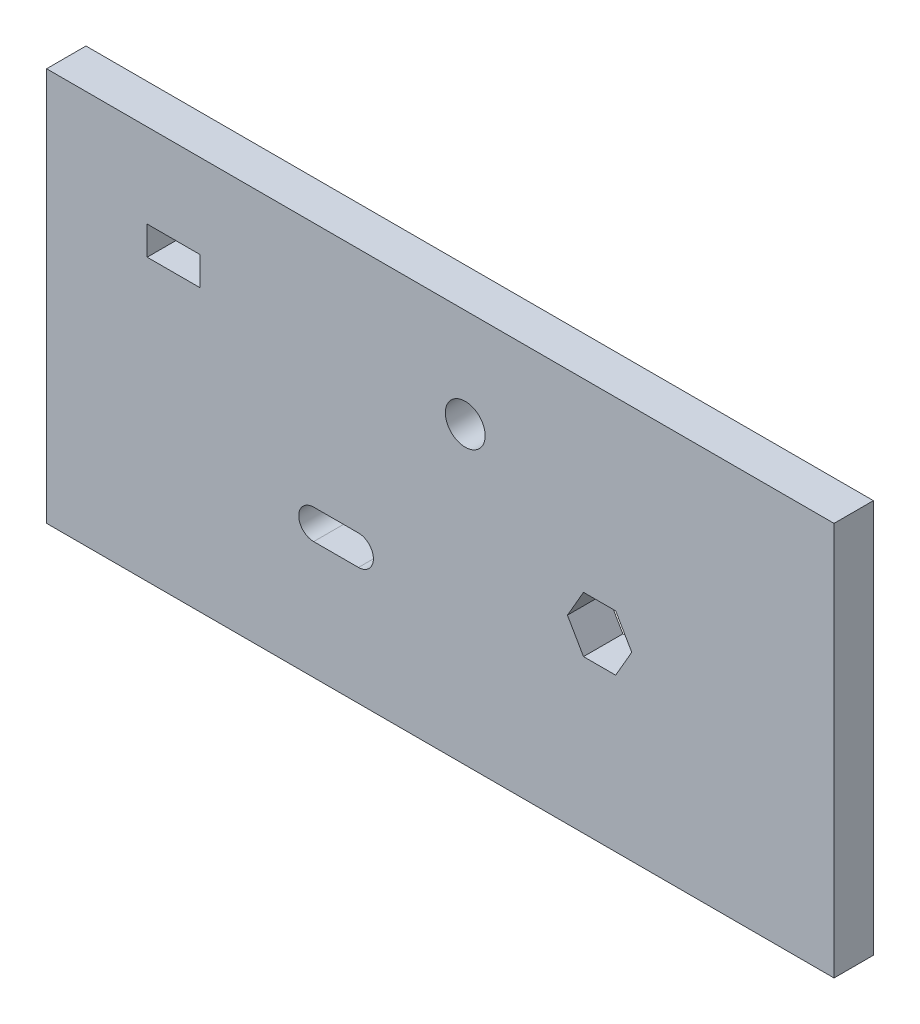
ISO-10303-21;
HEADER;
FILE_DESCRIPTION(('STEP AP214'),'2;1');
FILE_NAME('part.step','',(''),(''),'','','');
FILE_SCHEMA(('AUTOMOTIVE_DESIGN { 1 0 10303 214 1 1 1 1 }'));
ENDSEC;
DATA;
#1=APPLICATION_CONTEXT('core data for automotive mechanical design processes');
#2=APPLICATION_PROTOCOL_DEFINITION('international standard','automotive_design',2000,#1);
#3=PRODUCT_CONTEXT('',#1,'mechanical');
#4=PRODUCT('Part','Part','',(#3));
#5=PRODUCT_RELATED_PRODUCT_CATEGORY('part','',(#4));
#6=PRODUCT_DEFINITION_FORMATION('','',#4);
#7=PRODUCT_DEFINITION_CONTEXT('part definition',#1,'design');
#8=PRODUCT_DEFINITION('design','',#6,#7);
#9=PRODUCT_DEFINITION_SHAPE('','',#8);
#10=(LENGTH_UNIT() NAMED_UNIT(*) SI_UNIT(.MILLI.,.METRE.));
#11=(NAMED_UNIT(*) PLANE_ANGLE_UNIT() SI_UNIT($,.RADIAN.));
#12=(NAMED_UNIT(*) SI_UNIT($,.STERADIAN.) SOLID_ANGLE_UNIT());
#13=UNCERTAINTY_MEASURE_WITH_UNIT(LENGTH_MEASURE(1.E-05),#10,'distance_accuracy_value','');
#14=(GEOMETRIC_REPRESENTATION_CONTEXT(3) GLOBAL_UNCERTAINTY_ASSIGNED_CONTEXT((#13)) GLOBAL_UNIT_ASSIGNED_CONTEXT((#10,
#11,#12)) REPRESENTATION_CONTEXT('',''));
#15=CARTESIAN_POINT('',(0.,0.,0.));
#16=DIRECTION('',(0.,0.,1.));
#17=DIRECTION('',(1.,0.,0.));
#18=AXIS2_PLACEMENT_3D('',#15,#16,#17);
#19=CARTESIAN_POINT('',(0.,0.,10.));
#20=DIRECTION('',(-1.,0.,0.));
#21=DIRECTION('',(0.,-1.,0.));
#22=AXIS2_PLACEMENT_3D('',#19,#20,#21);
#23=PLANE('',#22);
#24=DIRECTION('',(0.,1.,0.));
#25=VECTOR('',#24,1.);
#26=CARTESIAN_POINT('',(0.,0.,0.));
#27=LINE('',#26,#25);
#28=CARTESIAN_POINT('',(0.,0.,0.));
#29=VERTEX_POINT('',#28);
#30=CARTESIAN_POINT('',(0.,100.,0.));
#31=VERTEX_POINT('',#30);
#32=EDGE_CURVE('E195',#29,#31,#27,.T.);
#33=ORIENTED_EDGE('',*,*,#32,.T.);
#34=DIRECTION('',(0.,0.,-1.));
#35=VECTOR('',#34,1.);
#36=CARTESIAN_POINT('',(0.,100.,10.));
#37=LINE('',#36,#35);
#38=CARTESIAN_POINT('',(0.,100.,10.));
#39=VERTEX_POINT('',#38);
#40=EDGE_CURVE('E11',#39,#31,#37,.T.);
#41=ORIENTED_EDGE('',*,*,#40,.F.);
#42=DIRECTION('',(0.,1.,0.));
#43=VECTOR('',#42,1.);
#44=CARTESIAN_POINT('',(0.,0.,10.));
#45=LINE('',#44,#43);
#46=CARTESIAN_POINT('',(0.,0.,10.));
#47=VERTEX_POINT('',#46);
#48=EDGE_CURVE('E282',#47,#39,#45,.T.);
#49=ORIENTED_EDGE('',*,*,#48,.F.);
#50=DIRECTION('',(0.,0.,-1.));
#51=VECTOR('',#50,1.);
#52=CARTESIAN_POINT('',(0.,0.,10.));
#53=LINE('',#52,#51);
#54=EDGE_CURVE('E292',#47,#29,#53,.T.);
#55=ORIENTED_EDGE('',*,*,#54,.T.);
#56=EDGE_LOOP('',(#33,#41,#49,#55));
#57=FACE_BOUND('',#56,.T.);
#58=ADVANCED_FACE('F34',(#57),#23,.F.);
#59=CARTESIAN_POINT('',(0.,100.,10.));
#60=DIRECTION('',(0.,-1.,0.));
#61=DIRECTION('',(1.,0.,0.));
#62=AXIS2_PLACEMENT_3D('',#59,#60,#61);
#63=PLANE('',#62);
#64=DIRECTION('',(-1.,0.,0.));
#65=VECTOR('',#64,1.);
#66=CARTESIAN_POINT('',(0.,100.,0.));
#67=LINE('',#66,#65);
#68=CARTESIAN_POINT('',(-200.,100.,0.));
#69=VERTEX_POINT('',#68);
#70=EDGE_CURVE('E295',#31,#69,#67,.T.);
#71=ORIENTED_EDGE('',*,*,#70,.T.);
#72=DIRECTION('',(0.,0.,-1.));
#73=VECTOR('',#72,1.);
#74=CARTESIAN_POINT('',(-200.,100.,10.));
#75=LINE('',#74,#73);
#76=CARTESIAN_POINT('',(-200.,100.,10.));
#77=VERTEX_POINT('',#76);
#78=EDGE_CURVE('E41',#77,#69,#75,.T.);
#79=ORIENTED_EDGE('',*,*,#78,.F.);
#80=DIRECTION('',(-1.,0.,0.));
#81=VECTOR('',#80,1.);
#82=CARTESIAN_POINT('',(0.,100.,10.));
#83=LINE('',#82,#81);
#84=EDGE_CURVE('E285',#39,#77,#83,.T.);
#85=ORIENTED_EDGE('',*,*,#84,.F.);
#86=ORIENTED_EDGE('',*,*,#40,.T.);
#87=EDGE_LOOP('',(#71,#79,#85,#86));
#88=FACE_BOUND('',#87,.T.);
#89=ADVANCED_FACE('F324',(#88),#63,.F.);
#90=CARTESIAN_POINT('',(-200.,0.,10.));
#91=DIRECTION('',(1.,0.,0.));
#92=DIRECTION('',(0.,0.,-1.));
#93=AXIS2_PLACEMENT_3D('',#90,#91,#92);
#94=PLANE('',#93);
#95=DIRECTION('',(0.,-1.,0.));
#96=VECTOR('',#95,1.);
#97=CARTESIAN_POINT('',(-200.,0.,0.));
#98=LINE('',#97,#96);
#99=CARTESIAN_POINT('',(-200.,0.,0.));
#100=VERTEX_POINT('',#99);
#101=EDGE_CURVE('E297',#69,#100,#98,.T.);
#102=ORIENTED_EDGE('',*,*,#101,.T.);
#103=DIRECTION('',(0.,0.,-1.));
#104=VECTOR('',#103,1.);
#105=CARTESIAN_POINT('',(-200.,0.,10.));
#106=LINE('',#105,#104);
#107=CARTESIAN_POINT('',(-200.,0.,10.));
#108=VERTEX_POINT('',#107);
#109=EDGE_CURVE('E302',#108,#100,#106,.T.);
#110=ORIENTED_EDGE('',*,*,#109,.F.);
#111=DIRECTION('',(0.,-1.,0.));
#112=VECTOR('',#111,1.);
#113=CARTESIAN_POINT('',(-200.,0.,10.));
#114=LINE('',#113,#112);
#115=EDGE_CURVE('E288',#77,#108,#114,.T.);
#116=ORIENTED_EDGE('',*,*,#115,.F.);
#117=ORIENTED_EDGE('',*,*,#78,.T.);
#118=EDGE_LOOP('',(#102,#110,#116,#117));
#119=FACE_BOUND('',#118,.T.);
#120=ADVANCED_FACE('F309',(#119),#94,.F.);
#121=CARTESIAN_POINT('',(0.,0.,10.));
#122=DIRECTION('',(0.,1.,0.));
#123=DIRECTION('',(0.,0.,1.));
#124=AXIS2_PLACEMENT_3D('',#121,#122,#123);
#125=PLANE('',#124);
#126=DIRECTION('',(1.,0.,0.));
#127=VECTOR('',#126,1.);
#128=CARTESIAN_POINT('',(0.,0.,0.));
#129=LINE('',#128,#127);
#130=EDGE_CURVE('E286',#100,#29,#129,.T.);
#131=ORIENTED_EDGE('',*,*,#130,.T.);
#132=ORIENTED_EDGE('',*,*,#54,.F.);
#133=DIRECTION('',(1.,0.,0.));
#134=VECTOR('',#133,1.);
#135=CARTESIAN_POINT('',(0.,0.,10.));
#136=LINE('',#135,#134);
#137=EDGE_CURVE('E290',#108,#47,#136,.T.);
#138=ORIENTED_EDGE('',*,*,#137,.F.);
#139=ORIENTED_EDGE('',*,*,#109,.T.);
#140=EDGE_LOOP('',(#131,#132,#138,#139));
#141=FACE_BOUND('',#140,.T.);
#142=ADVANCED_FACE('F317',(#141),#125,.F.);
#143=CARTESIAN_POINT('',(0.,0.,10.));
#144=DIRECTION('',(0.,0.,1.));
#145=DIRECTION('',(1.,0.,0.));
#146=AXIS2_PLACEMENT_3D('',#143,#144,#145);
#147=PLANE('',#146);
#148=DIRECTION('',(0.,-1.,0.));
#149=VECTOR('',#148,1.);
#150=CARTESIAN_POINT('',(-174.450647229588,78.6125765702489,10.));
#151=LINE('',#150,#149);
#152=CARTESIAN_POINT('',(-174.450647229588,78.6125765702489,10.));
#153=VERTEX_POINT('',#152);
#154=CARTESIAN_POINT('',(-174.450647229588,71.3216523896962,10.));
#155=VERTEX_POINT('',#154);
#156=EDGE_CURVE('E48',#153,#155,#151,.T.);
#157=ORIENTED_EDGE('',*,*,#156,.F.);
#158=DIRECTION('',(-1.,0.,0.));
#159=VECTOR('',#158,1.);
#160=CARTESIAN_POINT('',(-174.450647229588,78.6125765702489,10.));
#161=LINE('',#160,#159);
#162=CARTESIAN_POINT('',(-161.035346737371,78.6125765702489,10.));
#163=VERTEX_POINT('',#162);
#164=EDGE_CURVE('E179',#163,#153,#161,.T.);
#165=ORIENTED_EDGE('',*,*,#164,.F.);
#166=DIRECTION('',(0.,1.,0.));
#167=VECTOR('',#166,1.);
#168=CARTESIAN_POINT('',(-161.035346737371,78.6125765702489,10.));
#169=LINE('',#168,#167);
#170=CARTESIAN_POINT('',(-161.035346737371,71.3216523896962,10.));
#171=VERTEX_POINT('',#170);
#172=EDGE_CURVE('E182',#171,#163,#169,.T.);
#173=ORIENTED_EDGE('',*,*,#172,.F.);
#174=DIRECTION('',(1.,0.,0.));
#175=VECTOR('',#174,1.);
#176=CARTESIAN_POINT('',(-174.450647229588,71.3216523896962,10.));
#177=LINE('',#176,#175);
#178=EDGE_CURVE('E188',#155,#171,#177,.T.);
#179=ORIENTED_EDGE('',*,*,#178,.F.);
#180=EDGE_LOOP('',(#157,#165,#173,#179));
#181=FACE_BOUND('',#180,.T.);
#182=CARTESIAN_POINT('',(-93.6672073090637,74.9671144799726,10.));
#183=DIRECTION('',(0.,0.,1.));
#184=DIRECTION('',(1.,0.,0.));
#185=AXIS2_PLACEMENT_3D('',#182,#183,#184);
#186=CIRCLE('',#185,5.05340471616071);
#187=CARTESIAN_POINT('',(-88.613802592903,74.9671144799726,10.));
#188=VERTEX_POINT('',#187);
#189=EDGE_CURVE('E201',#188,#188,#186,.T.);
#190=ORIENTED_EDGE('',*,*,#189,.F.);
#191=EDGE_LOOP('',(#190));
#192=FACE_BOUND('',#191,.T.);
#193=CARTESIAN_POINT('',(-132.163286982382,33.7004836180443,10.));
#194=DIRECTION('',(0.,0.,1.));
#195=DIRECTION('',(1.,0.,0.));
#196=AXIS2_PLACEMENT_3D('',#193,#194,#195);
#197=CIRCLE('',#196,3.79128057388742);
#198=CARTESIAN_POINT('',(-132.163286982382,37.4917641919317,10.));
#199=VERTEX_POINT('',#198);
#200=CARTESIAN_POINT('',(-132.163286982382,29.9092030441568,10.));
#201=VERTEX_POINT('',#200);
#202=EDGE_CURVE('E56',#199,#201,#197,.T.);
#203=ORIENTED_EDGE('',*,*,#202,.F.);
#204=DIRECTION('',(-1.,0.,0.));
#205=VECTOR('',#204,1.);
#206=CARTESIAN_POINT('',(-132.163286982382,37.4917641919317,10.));
#207=LINE('',#206,#205);
#208=CARTESIAN_POINT('',(-120.78944526072,37.4917641919317,10.));
#209=VERTEX_POINT('',#208);
#210=EDGE_CURVE('E209',#209,#199,#207,.T.);
#211=ORIENTED_EDGE('',*,*,#210,.F.);
#212=CARTESIAN_POINT('',(-120.78944526072,33.7004836180443,10.));
#213=DIRECTION('',(0.,0.,1.));
#214=DIRECTION('',(1.,0.,0.));
#215=AXIS2_PLACEMENT_3D('',#212,#213,#214);
#216=CIRCLE('',#215,3.79128057388742);
#217=CARTESIAN_POINT('',(-120.78944526072,29.9092030441568,10.));
#218=VERTEX_POINT('',#217);
#219=EDGE_CURVE('E224',#218,#209,#216,.T.);
#220=ORIENTED_EDGE('',*,*,#219,.F.);
#221=DIRECTION('',(1.,0.,0.));
#222=VECTOR('',#221,1.);
#223=CARTESIAN_POINT('',(-132.163286982382,29.9092030441568,10.));
#224=LINE('',#223,#222);
#225=EDGE_CURVE('E220',#201,#218,#224,.T.);
#226=ORIENTED_EDGE('',*,*,#225,.F.);
#227=EDGE_LOOP('',(#203,#211,#220,#226));
#228=FACE_BOUND('',#227,.T.);
#229=DIRECTION('',(0.499999999999995,0.866025403784442,0.));
#230=VECTOR('',#229,1.);
#231=CARTESIAN_POINT('',(-55.4627646029674,38.877415617057,10.));
#232=LINE('',#231,#230);
#233=CARTESIAN_POINT('',(-55.4627646029674,38.877415617057,10.));
#234=VERTEX_POINT('',#233);
#235=CARTESIAN_POINT('',(-51.379847061858,45.9492362413728,10.));
#236=VERTEX_POINT('',#235);
#237=EDGE_CURVE('E255',#234,#236,#232,.T.);
#238=ORIENTED_EDGE('',*,*,#237,.F.);
#239=DIRECTION('',(1.,0.,0.));
#240=VECTOR('',#239,1.);
#241=CARTESIAN_POINT('',(-63.6285996851865,38.8774156170569,10.));
#242=LINE('',#241,#240);
#243=CARTESIAN_POINT('',(-63.6285996851865,38.8774156170569,10.));
#244=VERTEX_POINT('',#243);
#245=EDGE_CURVE('E239',#244,#234,#242,.T.);
#246=ORIENTED_EDGE('',*,*,#245,.F.);
#247=DIRECTION('',(0.500000000000007,-0.866025403784434,0.));
#248=VECTOR('',#247,1.);
#249=CARTESIAN_POINT('',(-67.711517226296,45.9492362413728,10.));
#250=LINE('',#249,#248);
#251=CARTESIAN_POINT('',(-67.711517226296,45.9492362413728,10.));
#252=VERTEX_POINT('',#251);
#253=EDGE_CURVE('E266',#252,#244,#250,.T.);
#254=ORIENTED_EDGE('',*,*,#253,.F.);
#255=DIRECTION('',(-0.499999999999996,-0.866025403784441,0.));
#256=VECTOR('',#255,1.);
#257=CARTESIAN_POINT('',(-63.6285996851866,53.0210568656886,10.));
#258=LINE('',#257,#256);
#259=CARTESIAN_POINT('',(-63.6285996851866,53.0210568656886,10.));
#260=VERTEX_POINT('',#259);
#261=EDGE_CURVE('E263',#260,#252,#258,.T.);
#262=ORIENTED_EDGE('',*,*,#261,.F.);
#263=DIRECTION('',(-1.,0.,0.));
#264=VECTOR('',#263,1.);
#265=CARTESIAN_POINT('',(-55.4627646029675,53.0210568656887,10.));
#266=LINE('',#265,#264);
#267=CARTESIAN_POINT('',(-55.4627646029675,53.0210568656887,10.));
#268=VERTEX_POINT('',#267);
#269=EDGE_CURVE('E260',#268,#260,#266,.T.);
#270=ORIENTED_EDGE('',*,*,#269,.F.);
#271=DIRECTION('',(-0.500000000000001,0.866025403784438,0.));
#272=VECTOR('',#271,1.);
#273=CARTESIAN_POINT('',(-51.379847061858,45.9492362413728,10.));
#274=LINE('',#273,#272);
#275=EDGE_CURVE('E257',#236,#268,#274,.T.);
#276=ORIENTED_EDGE('',*,*,#275,.F.);
#277=EDGE_LOOP('',(#238,#246,#254,#262,#270,#276));
#278=FACE_BOUND('',#277,.T.);
#279=ORIENTED_EDGE('',*,*,#48,.T.);
#280=ORIENTED_EDGE('',*,*,#84,.T.);
#281=ORIENTED_EDGE('',*,*,#115,.T.);
#282=ORIENTED_EDGE('',*,*,#137,.T.);
#283=EDGE_LOOP('',(#279,#280,#281,#282));
#284=FACE_BOUND('',#283,.T.);
#285=ADVANCED_FACE('F323',(#181,#192,#228,#278,#284),#147,.T.);
#286=CARTESIAN_POINT('',(0.,0.,0.));
#287=DIRECTION('',(0.,0.,1.));
#288=DIRECTION('',(1.,0.,0.));
#289=AXIS2_PLACEMENT_3D('',#286,#287,#288);
#290=PLANE('',#289);
#291=DIRECTION('',(-1.,0.,0.));
#292=VECTOR('',#291,1.);
#293=CARTESIAN_POINT('',(-174.450647229588,78.6125765702489,0.));
#294=LINE('',#293,#292);
#295=CARTESIAN_POINT('',(-161.035346737371,78.6125765702489,0.));
#296=VERTEX_POINT('',#295);
#297=CARTESIAN_POINT('',(-174.450647229588,78.6125765702489,0.));
#298=VERTEX_POINT('',#297);
#299=EDGE_CURVE('E166',#296,#298,#294,.T.);
#300=ORIENTED_EDGE('',*,*,#299,.T.);
#301=DIRECTION('',(0.,-1.,0.));
#302=VECTOR('',#301,1.);
#303=CARTESIAN_POINT('',(-174.450647229588,78.6125765702489,0.));
#304=LINE('',#303,#302);
#305=CARTESIAN_POINT('',(-174.450647229588,71.3216523896962,0.));
#306=VERTEX_POINT('',#305);
#307=EDGE_CURVE('E160',#298,#306,#304,.T.);
#308=ORIENTED_EDGE('',*,*,#307,.T.);
#309=DIRECTION('',(1.,0.,0.));
#310=VECTOR('',#309,1.);
#311=CARTESIAN_POINT('',(-174.450647229588,71.3216523896962,0.));
#312=LINE('',#311,#310);
#313=CARTESIAN_POINT('',(-161.035346737371,71.3216523896962,0.));
#314=VERTEX_POINT('',#313);
#315=EDGE_CURVE('E170',#306,#314,#312,.T.);
#316=ORIENTED_EDGE('',*,*,#315,.T.);
#317=DIRECTION('',(0.,1.,0.));
#318=VECTOR('',#317,1.);
#319=CARTESIAN_POINT('',(-161.035346737371,78.6125765702489,0.));
#320=LINE('',#319,#318);
#321=EDGE_CURVE('E174',#314,#296,#320,.T.);
#322=ORIENTED_EDGE('',*,*,#321,.T.);
#323=EDGE_LOOP('',(#300,#308,#316,#322));
#324=FACE_BOUND('',#323,.T.);
#325=CARTESIAN_POINT('',(-93.6672073090637,74.9671144799726,0.));
#326=DIRECTION('',(0.,0.,1.));
#327=DIRECTION('',(1.,0.,0.));
#328=AXIS2_PLACEMENT_3D('',#325,#326,#327);
#329=CIRCLE('',#328,5.05340471616071);
#330=CARTESIAN_POINT('',(-88.613802592903,74.9671144799726,0.));
#331=VERTEX_POINT('',#330);
#332=EDGE_CURVE('E189',#331,#331,#329,.T.);
#333=ORIENTED_EDGE('',*,*,#332,.T.);
#334=EDGE_LOOP('',(#333));
#335=FACE_BOUND('',#334,.T.);
#336=DIRECTION('',(-1.,0.,0.));
#337=VECTOR('',#336,1.);
#338=CARTESIAN_POINT('',(-132.163286982382,37.4917641919317,0.));
#339=LINE('',#338,#337);
#340=CARTESIAN_POINT('',(-120.78944526072,37.4917641919317,0.));
#341=VERTEX_POINT('',#340);
#342=CARTESIAN_POINT('',(-132.163286982382,37.4917641919317,0.));
#343=VERTEX_POINT('',#342);
#344=EDGE_CURVE('E215',#341,#343,#339,.T.);
#345=ORIENTED_EDGE('',*,*,#344,.T.);
#346=CARTESIAN_POINT('',(-132.163286982382,33.7004836180443,0.));
#347=DIRECTION('',(0.,0.,1.));
#348=DIRECTION('',(1.,0.,0.));
#349=AXIS2_PLACEMENT_3D('',#346,#347,#348);
#350=CIRCLE('',#349,3.79128057388742);
#351=CARTESIAN_POINT('',(-132.163286982382,29.9092030441568,0.));
#352=VERTEX_POINT('',#351);
#353=EDGE_CURVE('E205',#343,#352,#350,.T.);
#354=ORIENTED_EDGE('',*,*,#353,.T.);
#355=DIRECTION('',(1.,0.,0.));
#356=VECTOR('',#355,1.);
#357=CARTESIAN_POINT('',(-132.163286982382,29.9092030441568,0.));
#358=LINE('',#357,#356);
#359=CARTESIAN_POINT('',(-120.78944526072,29.9092030441568,0.));
#360=VERTEX_POINT('',#359);
#361=EDGE_CURVE('E208',#352,#360,#358,.T.);
#362=ORIENTED_EDGE('',*,*,#361,.T.);
#363=CARTESIAN_POINT('',(-120.78944526072,33.7004836180443,0.));
#364=DIRECTION('',(0.,0.,1.));
#365=DIRECTION('',(1.,0.,0.));
#366=AXIS2_PLACEMENT_3D('',#363,#364,#365);
#367=CIRCLE('',#366,3.79128057388742);
#368=EDGE_CURVE('E212',#360,#341,#367,.T.);
#369=ORIENTED_EDGE('',*,*,#368,.T.);
#370=EDGE_LOOP('',(#345,#354,#362,#369));
#371=FACE_BOUND('',#370,.T.);
#372=DIRECTION('',(1.,0.,0.));
#373=VECTOR('',#372,1.);
#374=CARTESIAN_POINT('',(-63.6285996851865,38.8774156170569,0.));
#375=LINE('',#374,#373);
#376=CARTESIAN_POINT('',(-63.6285996851865,38.8774156170569,0.));
#377=VERTEX_POINT('',#376);
#378=CARTESIAN_POINT('',(-55.4627646029674,38.877415617057,0.));
#379=VERTEX_POINT('',#378);
#380=EDGE_CURVE('E251',#377,#379,#375,.T.);
#381=ORIENTED_EDGE('',*,*,#380,.T.);
#382=DIRECTION('',(0.499999999999995,0.866025403784442,0.));
#383=VECTOR('',#382,1.);
#384=CARTESIAN_POINT('',(-55.4627646029674,38.877415617057,0.));
#385=LINE('',#384,#383);
#386=CARTESIAN_POINT('',(-51.379847061858,45.9492362413728,0.));
#387=VERTEX_POINT('',#386);
#388=EDGE_CURVE('E235',#379,#387,#385,.T.);
#389=ORIENTED_EDGE('',*,*,#388,.T.);
#390=DIRECTION('',(-0.500000000000001,0.866025403784438,0.));
#391=VECTOR('',#390,1.);
#392=CARTESIAN_POINT('',(-51.379847061858,45.9492362413728,0.));
#393=LINE('',#392,#391);
#394=CARTESIAN_POINT('',(-55.4627646029675,53.0210568656887,0.));
#395=VERTEX_POINT('',#394);
#396=EDGE_CURVE('E238',#387,#395,#393,.T.);
#397=ORIENTED_EDGE('',*,*,#396,.T.);
#398=DIRECTION('',(-1.,0.,0.));
#399=VECTOR('',#398,1.);
#400=CARTESIAN_POINT('',(-55.4627646029675,53.0210568656887,0.));
#401=LINE('',#400,#399);
#402=CARTESIAN_POINT('',(-63.6285996851866,53.0210568656886,0.));
#403=VERTEX_POINT('',#402);
#404=EDGE_CURVE('E242',#395,#403,#401,.T.);
#405=ORIENTED_EDGE('',*,*,#404,.T.);
#406=DIRECTION('',(-0.499999999999996,-0.866025403784441,0.));
#407=VECTOR('',#406,1.);
#408=CARTESIAN_POINT('',(-63.6285996851866,53.0210568656886,0.));
#409=LINE('',#408,#407);
#410=CARTESIAN_POINT('',(-67.711517226296,45.9492362413728,0.));
#411=VERTEX_POINT('',#410);
#412=EDGE_CURVE('E245',#403,#411,#409,.T.);
#413=ORIENTED_EDGE('',*,*,#412,.T.);
#414=DIRECTION('',(0.500000000000007,-0.866025403784434,0.));
#415=VECTOR('',#414,1.);
#416=CARTESIAN_POINT('',(-67.711517226296,45.9492362413728,0.));
#417=LINE('',#416,#415);
#418=EDGE_CURVE('E248',#411,#377,#417,.T.);
#419=ORIENTED_EDGE('',*,*,#418,.T.);
#420=EDGE_LOOP('',(#381,#389,#397,#405,#413,#419));
#421=FACE_BOUND('',#420,.T.);
#422=ORIENTED_EDGE('',*,*,#32,.F.);
#423=ORIENTED_EDGE('',*,*,#130,.F.);
#424=ORIENTED_EDGE('',*,*,#101,.F.);
#425=ORIENTED_EDGE('',*,*,#70,.F.);
#426=EDGE_LOOP('',(#422,#423,#424,#425));
#427=FACE_BOUND('',#426,.T.);
#428=ADVANCED_FACE('F176',(#324,#335,#371,#421,#427),#290,.F.);
#429=CARTESIAN_POINT('',(-55.4627646029674,38.877415617057,0.));
#430=DIRECTION('',(0.866025403784442,-0.499999999999995,0.));
#431=DIRECTION('',(0.499999999999995,0.866025403784442,0.));
#432=AXIS2_PLACEMENT_3D('',#429,#430,#431);
#433=PLANE('',#432);
#434=ORIENTED_EDGE('',*,*,#237,.T.);
#435=DIRECTION('',(0.,0.,1.));
#436=VECTOR('',#435,1.);
#437=CARTESIAN_POINT('',(-51.379847061858,45.9492362413728,0.));
#438=LINE('',#437,#436);
#439=EDGE_CURVE('E254',#387,#236,#438,.T.);
#440=ORIENTED_EDGE('',*,*,#439,.F.);
#441=ORIENTED_EDGE('',*,*,#388,.F.);
#442=DIRECTION('',(0.,0.,1.));
#443=VECTOR('',#442,1.);
#444=CARTESIAN_POINT('',(-55.4627646029674,38.877415617057,0.));
#445=LINE('',#444,#443);
#446=EDGE_CURVE('E221',#379,#234,#445,.T.);
#447=ORIENTED_EDGE('',*,*,#446,.T.);
#448=EDGE_LOOP('',(#434,#440,#441,#447));
#449=FACE_BOUND('',#448,.T.);
#450=ADVANCED_FACE('F336',(#449),#433,.F.);
#451=CARTESIAN_POINT('',(-63.6285996851865,38.8774156170569,0.));
#452=DIRECTION('',(0.,-1.,0.));
#453=DIRECTION('',(1.,0.,0.));
#454=AXIS2_PLACEMENT_3D('',#451,#452,#453);
#455=PLANE('',#454);
#456=ORIENTED_EDGE('',*,*,#245,.T.);
#457=ORIENTED_EDGE('',*,*,#446,.F.);
#458=ORIENTED_EDGE('',*,*,#380,.F.);
#459=DIRECTION('',(0.,0.,1.));
#460=VECTOR('',#459,1.);
#461=CARTESIAN_POINT('',(-63.6285996851865,38.8774156170569,0.));
#462=LINE('',#461,#460);
#463=EDGE_CURVE('E272',#377,#244,#462,.T.);
#464=ORIENTED_EDGE('',*,*,#463,.T.);
#465=EDGE_LOOP('',(#456,#457,#458,#464));
#466=FACE_BOUND('',#465,.T.);
#467=ADVANCED_FACE('F342',(#466),#455,.F.);
#468=CARTESIAN_POINT('',(-67.711517226296,45.9492362413728,0.));
#469=DIRECTION('',(-0.866025403784434,-0.500000000000007,0.));
#470=DIRECTION('',(0.500000000000007,-0.866025403784434,0.));
#471=AXIS2_PLACEMENT_3D('',#468,#469,#470);
#472=PLANE('',#471);
#473=ORIENTED_EDGE('',*,*,#253,.T.);
#474=ORIENTED_EDGE('',*,*,#463,.F.);
#475=ORIENTED_EDGE('',*,*,#418,.F.);
#476=DIRECTION('',(0.,0.,1.));
#477=VECTOR('',#476,1.);
#478=CARTESIAN_POINT('',(-67.711517226296,45.9492362413728,0.));
#479=LINE('',#478,#477);
#480=EDGE_CURVE('E274',#411,#252,#479,.T.);
#481=ORIENTED_EDGE('',*,*,#480,.T.);
#482=EDGE_LOOP('',(#473,#474,#475,#481));
#483=FACE_BOUND('',#482,.T.);
#484=ADVANCED_FACE('F356',(#483),#472,.F.);
#485=CARTESIAN_POINT('',(-63.6285996851866,53.0210568656886,0.));
#486=DIRECTION('',(-0.866025403784441,0.499999999999996,0.));
#487=DIRECTION('',(-0.499999999999996,-0.866025403784441,0.));
#488=AXIS2_PLACEMENT_3D('',#485,#486,#487);
#489=PLANE('',#488);
#490=ORIENTED_EDGE('',*,*,#261,.T.);
#491=ORIENTED_EDGE('',*,*,#480,.F.);
#492=ORIENTED_EDGE('',*,*,#412,.F.);
#493=DIRECTION('',(0.,0.,1.));
#494=VECTOR('',#493,1.);
#495=CARTESIAN_POINT('',(-63.6285996851866,53.0210568656886,0.));
#496=LINE('',#495,#494);
#497=EDGE_CURVE('E276',#403,#260,#496,.T.);
#498=ORIENTED_EDGE('',*,*,#497,.T.);
#499=EDGE_LOOP('',(#490,#491,#492,#498));
#500=FACE_BOUND('',#499,.T.);
#501=ADVANCED_FACE('F352',(#500),#489,.F.);
#502=CARTESIAN_POINT('',(-55.4627646029675,53.0210568656887,0.));
#503=DIRECTION('',(0.,1.,0.));
#504=DIRECTION('',(-1.,0.,0.));
#505=AXIS2_PLACEMENT_3D('',#502,#503,#504);
#506=PLANE('',#505);
#507=ORIENTED_EDGE('',*,*,#269,.T.);
#508=ORIENTED_EDGE('',*,*,#497,.F.);
#509=ORIENTED_EDGE('',*,*,#404,.F.);
#510=DIRECTION('',(0.,0.,1.));
#511=VECTOR('',#510,1.);
#512=CARTESIAN_POINT('',(-55.4627646029675,53.0210568656887,0.));
#513=LINE('',#512,#511);
#514=EDGE_CURVE('E278',#395,#268,#513,.T.);
#515=ORIENTED_EDGE('',*,*,#514,.T.);
#516=EDGE_LOOP('',(#507,#508,#509,#515));
#517=FACE_BOUND('',#516,.T.);
#518=ADVANCED_FACE('F348',(#517),#506,.F.);
#519=CARTESIAN_POINT('',(-51.379847061858,45.9492362413728,0.));
#520=DIRECTION('',(0.866025403784438,0.500000000000001,0.));
#521=DIRECTION('',(-0.500000000000001,0.866025403784438,0.));
#522=AXIS2_PLACEMENT_3D('',#519,#520,#521);
#523=PLANE('',#522);
#524=ORIENTED_EDGE('',*,*,#275,.T.);
#525=ORIENTED_EDGE('',*,*,#514,.F.);
#526=ORIENTED_EDGE('',*,*,#396,.F.);
#527=ORIENTED_EDGE('',*,*,#439,.T.);
#528=EDGE_LOOP('',(#524,#525,#526,#527));
#529=FACE_BOUND('',#528,.T.);
#530=ADVANCED_FACE('F344',(#529),#523,.F.);
#531=CARTESIAN_POINT('',(-132.163286982382,33.7004836180443,0.));
#532=DIRECTION('',(0.,0.,1.));
#533=DIRECTION('',(1.,0.,0.));
#534=AXIS2_PLACEMENT_3D('',#531,#532,#533);
#535=CYLINDRICAL_SURFACE('',#534,3.79128057388742);
#536=ORIENTED_EDGE('',*,*,#202,.T.);
#537=DIRECTION('',(0.,0.,1.));
#538=VECTOR('',#537,1.);
#539=CARTESIAN_POINT('',(-132.163286982382,29.9092030441568,0.));
#540=LINE('',#539,#538);
#541=EDGE_CURVE('E218',#352,#201,#540,.T.);
#542=ORIENTED_EDGE('',*,*,#541,.F.);
#543=ORIENTED_EDGE('',*,*,#353,.F.);
#544=DIRECTION('',(0.,0.,1.));
#545=VECTOR('',#544,1.);
#546=CARTESIAN_POINT('',(-132.163286982382,37.4917641919317,0.));
#547=LINE('',#546,#545);
#548=EDGE_CURVE('E204',#343,#199,#547,.T.);
#549=ORIENTED_EDGE('',*,*,#548,.T.);
#550=EDGE_LOOP('',(#536,#542,#543,#549));
#551=FACE_BOUND('',#550,.T.);
#552=ADVANCED_FACE('F347',(#551),#535,.F.);
#553=CARTESIAN_POINT('',(-132.163286982382,37.4917641919317,0.));
#554=DIRECTION('',(0.,1.,0.));
#555=DIRECTION('',(0.,0.,1.));
#556=AXIS2_PLACEMENT_3D('',#553,#554,#555);
#557=PLANE('',#556);
#558=ORIENTED_EDGE('',*,*,#210,.T.);
#559=ORIENTED_EDGE('',*,*,#548,.F.);
#560=ORIENTED_EDGE('',*,*,#344,.F.);
#561=DIRECTION('',(0.,0.,1.));
#562=VECTOR('',#561,1.);
#563=CARTESIAN_POINT('',(-120.78944526072,37.4917641919317,0.));
#564=LINE('',#563,#562);
#565=EDGE_CURVE('E230',#341,#209,#564,.T.);
#566=ORIENTED_EDGE('',*,*,#565,.T.);
#567=EDGE_LOOP('',(#558,#559,#560,#566));
#568=FACE_BOUND('',#567,.T.);
#569=ADVANCED_FACE('F366',(#568),#557,.F.);
#570=CARTESIAN_POINT('',(-120.78944526072,33.7004836180443,0.));
#571=DIRECTION('',(0.,0.,1.));
#572=DIRECTION('',(1.,0.,0.));
#573=AXIS2_PLACEMENT_3D('',#570,#571,#572);
#574=CYLINDRICAL_SURFACE('',#573,3.79128057388742);
#575=ORIENTED_EDGE('',*,*,#219,.T.);
#576=ORIENTED_EDGE('',*,*,#565,.F.);
#577=ORIENTED_EDGE('',*,*,#368,.F.);
#578=DIRECTION('',(0.,0.,1.));
#579=VECTOR('',#578,1.);
#580=CARTESIAN_POINT('',(-120.78944526072,29.9092030441568,0.));
#581=LINE('',#580,#579);
#582=EDGE_CURVE('E232',#360,#218,#581,.T.);
#583=ORIENTED_EDGE('',*,*,#582,.T.);
#584=EDGE_LOOP('',(#575,#576,#577,#583));
#585=FACE_BOUND('',#584,.T.);
#586=ADVANCED_FACE('F371',(#585),#574,.F.);
#587=CARTESIAN_POINT('',(-132.163286982382,29.9092030441568,0.));
#588=DIRECTION('',(0.,-1.,0.));
#589=DIRECTION('',(0.,0.,-1.));
#590=AXIS2_PLACEMENT_3D('',#587,#588,#589);
#591=PLANE('',#590);
#592=ORIENTED_EDGE('',*,*,#225,.T.);
#593=ORIENTED_EDGE('',*,*,#582,.F.);
#594=ORIENTED_EDGE('',*,*,#361,.F.);
#595=ORIENTED_EDGE('',*,*,#541,.T.);
#596=EDGE_LOOP('',(#592,#593,#594,#595));
#597=FACE_BOUND('',#596,.T.);
#598=ADVANCED_FACE('F367',(#597),#591,.F.);
#599=CARTESIAN_POINT('',(-93.6672073090637,74.9671144799726,0.));
#600=DIRECTION('',(0.,0.,1.));
#601=DIRECTION('',(1.,0.,0.));
#602=AXIS2_PLACEMENT_3D('',#599,#600,#601);
#603=CYLINDRICAL_SURFACE('',#602,5.05340471616071);
#604=ORIENTED_EDGE('',*,*,#332,.F.);
#605=EDGE_LOOP('',(#604));
#606=FACE_BOUND('',#605,.T.);
#607=ORIENTED_EDGE('',*,*,#189,.T.);
#608=EDGE_LOOP('',(#607));
#609=FACE_BOUND('',#608,.T.);
#610=ADVANCED_FACE('F370',(#606,#609),#603,.F.);
#611=CARTESIAN_POINT('',(-174.450647229588,78.6125765702489,0.));
#612=DIRECTION('',(-1.,0.,0.));
#613=DIRECTION('',(0.,0.,1.));
#614=AXIS2_PLACEMENT_3D('',#611,#612,#613);
#615=PLANE('',#614);
#616=ORIENTED_EDGE('',*,*,#156,.T.);
#617=DIRECTION('',(0.,0.,1.));
#618=VECTOR('',#617,1.);
#619=CARTESIAN_POINT('',(-174.450647229588,71.3216523896962,0.));
#620=LINE('',#619,#618);
#621=EDGE_CURVE('E156',#306,#155,#620,.T.);
#622=ORIENTED_EDGE('',*,*,#621,.F.);
#623=ORIENTED_EDGE('',*,*,#307,.F.);
#624=DIRECTION('',(0.,0.,1.));
#625=VECTOR('',#624,1.);
#626=CARTESIAN_POINT('',(-174.450647229588,78.6125765702489,0.));
#627=LINE('',#626,#625);
#628=EDGE_CURVE('E193',#298,#153,#627,.T.);
#629=ORIENTED_EDGE('',*,*,#628,.T.);
#630=EDGE_LOOP('',(#616,#622,#623,#629));
#631=FACE_BOUND('',#630,.T.);
#632=ADVANCED_FACE('F158',(#631),#615,.F.);
#633=CARTESIAN_POINT('',(-174.450647229588,78.6125765702489,0.));
#634=DIRECTION('',(0.,1.,0.));
#635=DIRECTION('',(0.,0.,1.));
#636=AXIS2_PLACEMENT_3D('',#633,#634,#635);
#637=PLANE('',#636);
#638=ORIENTED_EDGE('',*,*,#164,.T.);
#639=ORIENTED_EDGE('',*,*,#628,.F.);
#640=ORIENTED_EDGE('',*,*,#299,.F.);
#641=DIRECTION('',(0.,0.,1.));
#642=VECTOR('',#641,1.);
#643=CARTESIAN_POINT('',(-161.035346737371,78.6125765702489,0.));
#644=LINE('',#643,#642);
#645=EDGE_CURVE('E196',#296,#163,#644,.T.);
#646=ORIENTED_EDGE('',*,*,#645,.T.);
#647=EDGE_LOOP('',(#638,#639,#640,#646));
#648=FACE_BOUND('',#647,.T.);
#649=ADVANCED_FACE('F384',(#648),#637,.F.);
#650=CARTESIAN_POINT('',(-161.035346737371,78.6125765702489,0.));
#651=DIRECTION('',(1.,0.,0.));
#652=DIRECTION('',(0.,0.,-1.));
#653=AXIS2_PLACEMENT_3D('',#650,#651,#652);
#654=PLANE('',#653);
#655=ORIENTED_EDGE('',*,*,#172,.T.);
#656=ORIENTED_EDGE('',*,*,#645,.F.);
#657=ORIENTED_EDGE('',*,*,#321,.F.);
#658=DIRECTION('',(0.,0.,1.));
#659=VECTOR('',#658,1.);
#660=CARTESIAN_POINT('',(-161.035346737371,71.3216523896962,0.));
#661=LINE('',#660,#659);
#662=EDGE_CURVE('E165',#314,#171,#661,.T.);
#663=ORIENTED_EDGE('',*,*,#662,.T.);
#664=EDGE_LOOP('',(#655,#656,#657,#663));
#665=FACE_BOUND('',#664,.T.);
#666=ADVANCED_FACE('F387',(#665),#654,.F.);
#667=CARTESIAN_POINT('',(-174.450647229588,71.3216523896962,0.));
#668=DIRECTION('',(0.,-1.,0.));
#669=DIRECTION('',(0.,0.,-1.));
#670=AXIS2_PLACEMENT_3D('',#667,#668,#669);
#671=PLANE('',#670);
#672=ORIENTED_EDGE('',*,*,#178,.T.);
#673=ORIENTED_EDGE('',*,*,#662,.F.);
#674=ORIENTED_EDGE('',*,*,#315,.F.);
#675=ORIENTED_EDGE('',*,*,#621,.T.);
#676=EDGE_LOOP('',(#672,#673,#674,#675));
#677=FACE_BOUND('',#676,.T.);
#678=ADVANCED_FACE('F171',(#677),#671,.F.);
#679=CLOSED_SHELL('',(#58,#89,#120,#142,#285,#428,#450,#467,#484,#501,#518,#530,#552,#569,#586,
#598,#610,#632,#649,#666,#678));
#680=MANIFOLD_SOLID_BREP('B2',#679);
#681=ADVANCED_BREP_SHAPE_REPRESENTATION('',(#18,#680),#14);
#682=SHAPE_DEFINITION_REPRESENTATION(#9,#681);
ENDSEC;
END-ISO-10303-21;
